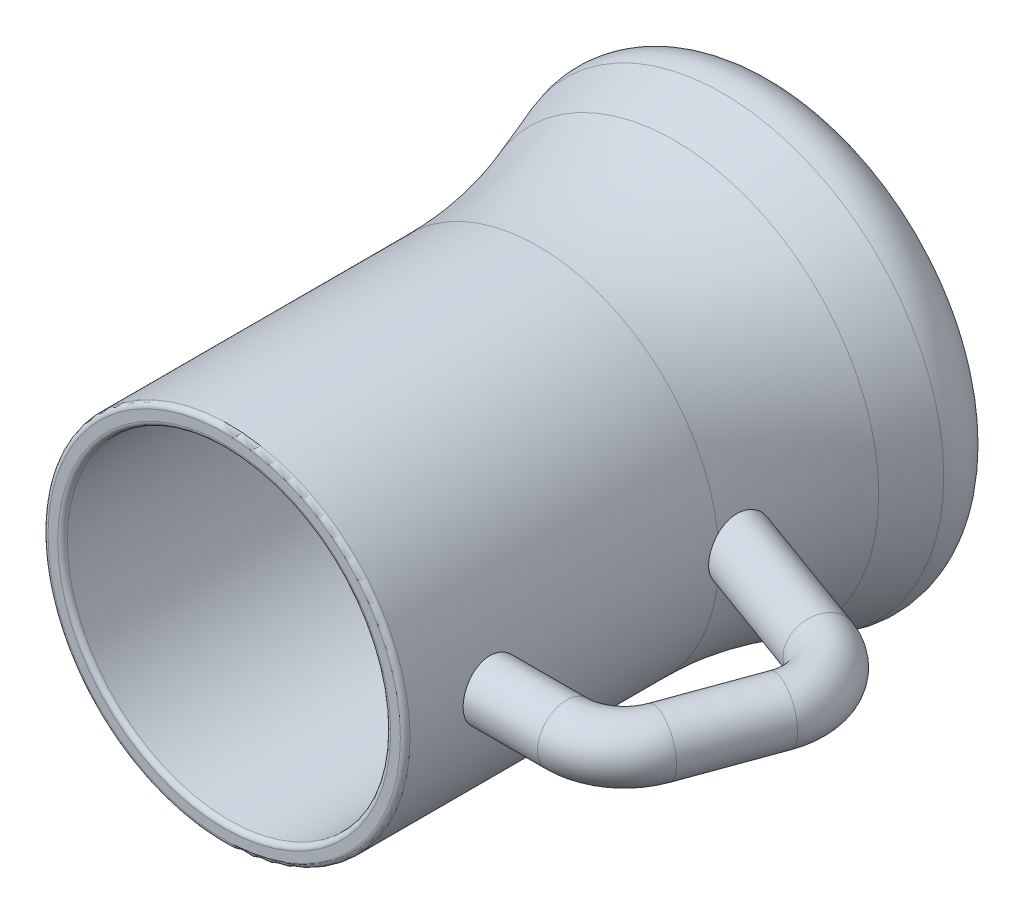
ISO-10303-21;
HEADER;
FILE_DESCRIPTION(('STEP AP214'),'2;1');
FILE_NAME('part.step','',(''),(''),'','','');
FILE_SCHEMA(('AUTOMOTIVE_DESIGN { 1 0 10303 214 1 1 1 1 }'));
ENDSEC;
DATA;
#1=APPLICATION_CONTEXT('core data for automotive mechanical design processes');
#2=APPLICATION_PROTOCOL_DEFINITION('international standard','automotive_design',2000,#1);
#3=PRODUCT_CONTEXT('',#1,'mechanical');
#4=PRODUCT('Part','Part','',(#3));
#5=PRODUCT_RELATED_PRODUCT_CATEGORY('part','',(#4));
#6=PRODUCT_DEFINITION_FORMATION('','',#4);
#7=PRODUCT_DEFINITION_CONTEXT('part definition',#1,'design');
#8=PRODUCT_DEFINITION('design','',#6,#7);
#9=PRODUCT_DEFINITION_SHAPE('','',#8);
#10=(LENGTH_UNIT() NAMED_UNIT(*) SI_UNIT(.MILLI.,.METRE.));
#11=(NAMED_UNIT(*) PLANE_ANGLE_UNIT() SI_UNIT($,.RADIAN.));
#12=(NAMED_UNIT(*) SI_UNIT($,.STERADIAN.) SOLID_ANGLE_UNIT());
#13=UNCERTAINTY_MEASURE_WITH_UNIT(LENGTH_MEASURE(1.E-05),#10,'distance_accuracy_value','');
#14=(GEOMETRIC_REPRESENTATION_CONTEXT(3) GLOBAL_UNCERTAINTY_ASSIGNED_CONTEXT((#13)) GLOBAL_UNIT_ASSIGNED_CONTEXT((#10,
#11,#12)) REPRESENTATION_CONTEXT('',''));
#15=CARTESIAN_POINT('',(0.,0.,0.));
#16=DIRECTION('',(0.,0.,1.));
#17=DIRECTION('',(1.,0.,0.));
#18=AXIS2_PLACEMENT_3D('',#15,#16,#17);
#19=CARTESIAN_POINT('',(0.,0.,130.02398624452));
#20=DIRECTION('',(0.,0.,1.));
#21=DIRECTION('',(1.,0.,0.));
#22=AXIS2_PLACEMENT_3D('',#19,#20,#21);
#23=CYLINDRICAL_SURFACE('',#22,37.5);
#24=CARTESIAN_POINT('',(0.,0.,114.));
#25=DIRECTION('',(0.,0.,1.));
#26=DIRECTION('',(1.,0.,0.));
#27=AXIS2_PLACEMENT_3D('',#24,#25,#26);
#28=CIRCLE('',#27,37.5);
#29=CARTESIAN_POINT('',(37.5,0.,114.));
#30=VERTEX_POINT('',#29);
#31=EDGE_CURVE('E12',#30,#30,#28,.F.);
#32=ORIENTED_EDGE('',*,*,#31,.T.);
#33=EDGE_LOOP('',(#32));
#34=FACE_BOUND('',#33,.T.);
#35=CARTESIAN_POINT('',(37.2399667718745,4.40850029258043,50.));
#36=CARTESIAN_POINT('',(37.2528417213684,4.29973883053072,50.1300651858803));
#37=CARTESIAN_POINT('',(37.2658348105075,4.18590441938662,50.2559125101006));
#38=CARTESIAN_POINT('',(37.2917317094705,3.94854544782049,50.4982373817453));
#39=CARTESIAN_POINT('',(37.3046354718583,3.82501611310328,50.6147102547791));
#40=CARTESIAN_POINT('',(37.3300686730311,3.56828744091065,50.8376941424756));
#41=CARTESIAN_POINT('',(37.3425962877566,3.43504923521504,50.9441607129624));
#42=CARTESIAN_POINT('',(37.3668724624839,3.16004584063132,51.1455168910524));
#43=CARTESIAN_POINT('',(37.3786211383543,3.01828192597008,51.2404082222679));
#44=CARTESIAN_POINT('',(37.4010400076255,2.72647908842261,51.4179112152152));
#45=CARTESIAN_POINT('',(37.4117062539021,2.57641276083976,51.5004784177269));
#46=CARTESIAN_POINT('',(37.4315822409388,2.26942744303802,51.6519149828528));
#47=CARTESIAN_POINT('',(37.4407920855859,2.11250894261324,51.7207853225721));
#48=CARTESIAN_POINT('',(37.4574386130119,1.7932609360937,51.8437786206989));
#49=CARTESIAN_POINT('',(37.4648788675029,1.6309430963465,51.8979313170543));
#50=CARTESIAN_POINT('',(37.4777557109103,1.30189212734659,51.9908753164291));
#51=CARTESIAN_POINT('',(37.4831925010701,1.13515944335913,52.0296681623392));
#52=CARTESIAN_POINT('',(37.4915339935669,0.811775613727049,52.0888999435726));
#53=CARTESIAN_POINT('',(37.4946024225787,0.655345937661658,52.1105293636725));
#54=CARTESIAN_POINT('',(37.4987770444941,0.34116603347988,52.1399088649867));
#55=CARTESIAN_POINT('',(37.4998833646155,0.183415891645174,52.1476598460403));
#56=CARTESIAN_POINT('',(37.500099134858,-0.132180354824011,52.1491734226916));
#57=CARTESIAN_POINT('',(37.4992082188163,-0.290026471750141,52.1429334532613));
#58=CARTESIAN_POINT('',(37.4954567760879,-0.604524981316124,52.1165489187813));
#59=CARTESIAN_POINT('',(37.4925962952565,-0.761177401661687,52.0964046774499));
#60=CARTESIAN_POINT('',(37.4852023409855,-1.06359176095953,52.0439654468914));
#61=CARTESIAN_POINT('',(37.4807685047483,-1.20948205027834,52.0123922376933));
#62=CARTESIAN_POINT('',(37.4703391078392,-1.4981862549288,51.9374391813937));
#63=CARTESIAN_POINT('',(37.464343035285,-1.64099914528317,51.8940554642529));
#64=CARTESIAN_POINT('',(37.4509474773023,-1.92260120012698,51.795980510795));
#65=CARTESIAN_POINT('',(37.4435481600785,-2.06139084458046,51.7412906296601));
#66=CARTESIAN_POINT('',(37.4275332040019,-2.33419505481857,51.6211837467076));
#67=CARTESIAN_POINT('',(37.4189171319166,-2.46820789841771,51.5557629227301));
#68=CARTESIAN_POINT('',(37.3907947124359,-2.87286926826615,51.3384991466776));
#69=CARTESIAN_POINT('',(37.3695903563806,-3.13450062019508,51.1697245712932));
#70=CARTESIAN_POINT('',(37.3248566455903,-3.62860420235922,50.7946961512547));
#71=CARTESIAN_POINT('',(37.3013293206761,-3.8611014938905,50.5884748977329));
#72=CARTESIAN_POINT('',(37.2713894426725,-4.13483814413137,50.3077610844777));
#73=CARTESIAN_POINT('',(37.2650832462096,-4.19126083155353,50.2476149908514));
#74=CARTESIAN_POINT('',(37.2524985855319,-4.30167729253364,50.1253142553859));
#75=CARTESIAN_POINT('',(37.2462200925346,-4.35567498438758,50.0631631546713));
#76=CARTESIAN_POINT('',(37.2399667718745,-4.40850029258047,50.));
#77=B_SPLINE_CURVE_WITH_KNOTS('',3,(#35,#36,#37,#38,#39,#40,#41,#42,#43,#44,#45,#46,#47,#48,#49,
#50,#51,#52,#53,#54,#55,#56,#57,#58,#59,#60,#61,#62,#63,#64,#65,#66,#67,#68,#69,#70,#71,#72,#73,
#74,#75,#76),.UNSPECIFIED.,.F.,.F.,(4,2,2,2,2,2,2,2,2,2,2,2,2,2,2,2,2,2,2,2,4),(0.,
0.510017798316121,1.02028835171471,1.53272767081646,2.04509059169508,2.55925936637044,
3.07339144817252,3.58647683639628,4.09951067231875,4.57274046485726,5.04593957338017,
5.51922544285365,5.99250029369196,6.43999054483434,6.88762760538726,7.33521104223658,
7.78295424743991,8.71505319863551,9.64634476677472,9.89443670666789,10.1421121879903),.UNSPECIFIED.);
#78=CARTESIAN_POINT('',(37.2399667718745,4.40850029258044,50.));
#79=VERTEX_POINT('',#78);
#80=CARTESIAN_POINT('',(37.2399667718745,-4.40850029258043,50.));
#81=VERTEX_POINT('',#80);
#82=EDGE_CURVE('E81',#79,#81,#77,.T.);
#83=ORIENTED_EDGE('',*,*,#82,.F.);
#84=CARTESIAN_POINT('',(0.,0.,50.));
#85=DIRECTION('',(0.,0.,1.));
#86=DIRECTION('',(1.,0.,0.));
#87=AXIS2_PLACEMENT_3D('',#84,#85,#86);
#88=CIRCLE('',#87,37.5);
#89=EDGE_CURVE('E74',#79,#81,#88,.T.);
#90=ORIENTED_EDGE('',*,*,#89,.T.);
#91=EDGE_LOOP('',(#83,#90));
#92=FACE_BOUND('',#91,.T.);
#93=CARTESIAN_POINT('',(37.5,0.,91.));
#94=CARTESIAN_POINT('',(37.5000010297067,0.167423179225958,90.9999975448329));
#95=CARTESIAN_POINT('',(37.4988766771693,0.334812646585461,91.007009863588));
#96=CARTESIAN_POINT('',(37.4944128936514,0.668441726936582,91.0350019838052));
#97=CARTESIAN_POINT('',(37.491073012713,0.834681099420982,91.0559846225426));
#98=CARTESIAN_POINT('',(37.4822675160668,1.16487135268081,91.111780169774));
#99=CARTESIAN_POINT('',(37.4768005161293,1.32882067107968,91.1466020845406));
#100=CARTESIAN_POINT('',(37.4638922302405,1.65322069309242,91.229825774973));
#101=CARTESIAN_POINT('',(37.4564502201466,1.81367009005214,91.2782325319314));
#102=CARTESIAN_POINT('',(37.4398106857423,2.12969171718163,91.3881935527712));
#103=CARTESIAN_POINT('',(37.4306152278353,2.28526943974686,91.4497323508683));
#104=CARTESIAN_POINT('',(37.4107150279844,2.59072128472719,91.5855645314578));
#105=CARTESIAN_POINT('',(37.4000097301527,2.74059328050093,91.6598626138241));
#106=CARTESIAN_POINT('',(37.3773945970652,3.03346959496931,91.8206222872298));
#107=CARTESIAN_POINT('',(37.3654853730654,3.17647734491568,91.9070777143882));
#108=CARTESIAN_POINT('',(37.3407817532782,3.45478588721243,92.0916049748585));
#109=CARTESIAN_POINT('',(37.3279870293669,3.59008378843343,92.1896811239427));
#110=CARTESIAN_POINT('',(37.301770201113,3.85298928374147,92.3975262604128));
#111=CARTESIAN_POINT('',(37.2883440916036,3.98053115354277,92.507377885833));
#112=CARTESIAN_POINT('',(37.2613256645451,4.22597475675382,92.7374373218082));
#113=CARTESIAN_POINT('',(37.2477332873123,4.34387290431423,92.8576489507367));
#114=CARTESIAN_POINT('',(37.2207726911569,4.56912981190639,93.1075279284043));
#115=CARTESIAN_POINT('',(37.2074044048343,4.67649178984925,93.2371923688883));
#116=CARTESIAN_POINT('',(37.1812594611025,4.88000800069889,93.5051694645004));
#117=CARTESIAN_POINT('',(37.1684830237212,4.97615808526981,93.643485291694));
#118=CARTESIAN_POINT('',(37.1438244358879,5.15700333213702,93.9285258735638));
#119=CARTESIAN_POINT('',(37.1319473762706,5.24163517669429,94.0752912578209));
#120=CARTESIAN_POINT('',(37.1095018335648,5.39825294431004,94.3755844166438));
#121=CARTESIAN_POINT('',(37.098933839377,5.47023414687261,94.5291146888653));
#122=CARTESIAN_POINT('',(37.0794246657367,5.60095050678289,94.8417525215417));
#123=CARTESIAN_POINT('',(37.0704828064266,5.65969120221979,95.0008577178847));
#124=CARTESIAN_POINT('',(37.054478291856,5.76353698215718,95.323566424468));
#125=CARTESIAN_POINT('',(37.0474163235514,5.80863708288461,95.4871715550595));
#126=CARTESIAN_POINT('',(37.0294981980135,5.9221980383629,95.98005032948));
#127=CARTESIAN_POINT('',(37.0217144694083,5.97018379729419,96.3144228255584));
#128=CARTESIAN_POINT('',(37.0153633025703,6.00942867521248,96.9863740651942));
#129=CARTESIAN_POINT('',(37.0167952630293,6.00069149527602,97.3239525981279));
#130=CARTESIAN_POINT('',(37.0286324250969,5.92720183110585,97.9895815877446));
#131=CARTESIAN_POINT('',(37.0389524866319,5.86298081421195,98.3176920131676));
#132=CARTESIAN_POINT('',(37.0672741331649,5.68115953303478,98.9584068323246));
#133=CARTESIAN_POINT('',(37.0852759626925,5.56355756949674,99.2710107320939));
#134=CARTESIAN_POINT('',(37.1270245256994,5.27777333132398,99.8734568275056));
#135=CARTESIAN_POINT('',(37.1507964469265,5.10936848577275,100.163191637414));
#136=CARTESIAN_POINT('',(37.2013892244405,4.72691566773003,100.710491076718));
#137=CARTESIAN_POINT('',(37.2282103078337,4.51286429437435,100.968053306849));
#138=CARTESIAN_POINT('',(37.2822543787543,4.04228949845585,101.446776330029));
#139=CARTESIAN_POINT('',(37.3094784614686,3.78530955988793,101.667488502113));
#140=CARTESIAN_POINT('',(37.3609778111527,3.23772113052164,102.062724235623));
#141=CARTESIAN_POINT('',(37.3852530617817,2.94711245338832,102.237247541102));
#142=CARTESIAN_POINT('',(37.4281501713543,2.34010766318689,102.535185029246));
#143=CARTESIAN_POINT('',(37.4467678728077,2.02369280178977,102.658561650538));
#144=CARTESIAN_POINT('',(37.4762182677123,1.37426950229409,102.850298075046));
#145=CARTESIAN_POINT('',(37.4870515607766,1.04126234437104,102.918662115789));
#146=CARTESIAN_POINT('',(37.4996323936636,0.371976166048773,102.997829410061));
#147=CARTESIAN_POINT('',(37.5014771989801,0.035771800820724,103.0092488992));
#148=CARTESIAN_POINT('',(37.4961389253268,-0.633748114372853,102.975842853845));
#149=CARTESIAN_POINT('',(37.4889561656159,-0.96706376607768,102.931019308379));
#150=CARTESIAN_POINT('',(37.4664300043718,-1.61945639518903,102.78691211069));
#151=CARTESIAN_POINT('',(37.4511320333319,-1.9386020249721,102.687931543746));
#152=CARTESIAN_POINT('',(37.4140843851777,-2.55576896999204,102.438641574749));
#153=CARTESIAN_POINT('',(37.392334369717,-2.85378917639216,102.288329480799));
#154=CARTESIAN_POINT('',(37.344555642749,-3.42293596002199,101.939218076078));
#155=CARTESIAN_POINT('',(37.3184933162451,-3.69382203414239,101.740031369112));
#156=CARTESIAN_POINT('',(37.2650878729161,-4.19854244432891,101.299359259713));
#157=CARTESIAN_POINT('',(37.2377446708669,-4.43237431041367,101.057871039778));
#158=CARTESIAN_POINT('',(37.1845470423324,-4.85861608957723,100.536699880366));
#159=CARTESIAN_POINT('',(37.1587092452075,-5.05061097360007,100.256675579723));
#160=CARTESIAN_POINT('',(37.1117524574538,-5.3848343251556,99.6679747406724));
#161=CARTESIAN_POINT('',(37.0906333260134,-5.52706427781566,99.3592990576518));
#162=CARTESIAN_POINT('',(37.0556256843081,-5.75709605637899,98.7233136839854));
#163=CARTESIAN_POINT('',(37.041709120546,-5.84510931144624,98.396081883175));
#164=CARTESIAN_POINT('',(37.0226190222289,-5.96485669264979,97.7310530473684));
#165=CARTESIAN_POINT('',(37.0174447926263,-5.99659529283781,97.3932568544552));
#166=CARTESIAN_POINT('',(37.0166748542779,-6.00130028924052,96.8884487025562));
#167=CARTESIAN_POINT('',(37.0175606744562,-5.99585788857062,96.721371492288));
#168=CARTESIAN_POINT('',(37.0215687929568,-5.97106768469098,96.3882957817168));
#169=CARTESIAN_POINT('',(37.0246902523302,-5.95172509767428,96.222296900331));
#170=CARTESIAN_POINT('',(37.0330845058553,-5.89926634093825,95.8924970267949));
#171=CARTESIAN_POINT('',(37.038358070928,-5.86614523543575,95.7286968439965));
#172=CARTESIAN_POINT('',(37.0509005138249,-5.78639793610083,95.4045562814721));
#173=CARTESIAN_POINT('',(37.0581686720823,-5.73977661225484,95.2442146764916));
#174=CARTESIAN_POINT('',(37.0744876957454,-5.63340499429301,94.9281567948623));
#175=CARTESIAN_POINT('',(37.0835374222532,-5.57366308492977,94.7724376360421));
#176=CARTESIAN_POINT('',(37.1031616451686,-5.44149381296154,94.4666466412756));
#177=CARTESIAN_POINT('',(37.1137355938816,-5.36907100495135,94.3165728011333));
#178=CARTESIAN_POINT('',(37.1361173698711,-5.21201282464205,94.0229797787779));
#179=CARTESIAN_POINT('',(37.1479256749221,-5.1273727186065,93.8794631657477));
#180=CARTESIAN_POINT('',(37.172438533989,-4.94652741293955,93.6000662881418));
#181=CARTESIAN_POINT('',(37.1851427709992,-4.85032629551532,93.4641833528306));
#182=CARTESIAN_POINT('',(37.2112463277708,-4.64584610822241,93.1994201742006));
#183=CARTESIAN_POINT('',(37.2246518854033,-4.53744270444941,93.070636551549));
#184=CARTESIAN_POINT('',(37.2516413357882,-4.31025462520875,92.8226839823523));
#185=CARTESIAN_POINT('',(37.265225162959,-4.1914736812168,92.7035116092689));
#186=CARTESIAN_POINT('',(37.2922035001734,-3.94423963396234,92.4754811430933));
#187=CARTESIAN_POINT('',(37.305597892233,-3.81578079318061,92.3666292562169));
#188=CARTESIAN_POINT('',(37.3318093493354,-3.55018419875224,92.1601157730103));
#189=CARTESIAN_POINT('',(37.3446266257092,-3.41304966699032,92.0624500599102));
#190=CARTESIAN_POINT('',(37.3694136446143,-3.13005260320636,91.8783345661303));
#191=CARTESIAN_POINT('',(37.3813771244772,-2.98413768991785,91.7919644248338));
#192=CARTESIAN_POINT('',(37.4040171674335,-2.68550080015101,91.6318737290757));
#193=CARTESIAN_POINT('',(37.4146942033656,-2.53278135315885,91.5581485226594));
#194=CARTESIAN_POINT('',(37.4344554358417,-2.22166903273263,91.4239024145374));
#195=CARTESIAN_POINT('',(37.4435407619572,-2.06328027949445,91.3633721414123));
#196=CARTESIAN_POINT('',(37.459866954328,-1.7419151793877,91.2559210476895));
#197=CARTESIAN_POINT('',(37.4671082233894,-1.57893984304042,91.208997254653));
#198=CARTESIAN_POINT('',(37.4820441859814,-1.18310727034035,91.1130005828138));
#199=CARTESIAN_POINT('',(37.4887467718645,-0.948542480152331,91.0706744533807));
#200=CARTESIAN_POINT('',(37.4977239136334,-0.475962393586731,91.0141761197434));
#201=CARTESIAN_POINT('',(37.499998536548,-0.237947149495822,91.0000034893616));
#202=CARTESIAN_POINT('',(37.5,0.,91.));
#203=B_SPLINE_CURVE_WITH_KNOTS('',3,(#93,#94,#95,#96,#97,#98,#99,#100,#101,#102,#103,#104,#105,
#106,#107,#108,#109,#110,#111,#112,#113,#114,#115,#116,#117,#118,#119,#120,#121,#122,#123,#124,
#125,#126,#127,#128,#129,#130,#131,#132,#133,#134,#135,#136,#137,#138,#139,#140,#141,#142,#143,
#144,#145,#146,#147,#148,#149,#150,#151,#152,#153,#154,#155,#156,#157,#158,#159,#160,#161,#162,
#163,#164,#165,#166,#167,#168,#169,#170,#171,#172,#173,#174,#175,#176,#177,#178,#179,#180,#181,
#182,#183,#184,#185,#186,#187,#188,#189,#190,#191,#192,#193,#194,#195,#196,#197,#198,#199,#200,
#201,#202),.UNSPECIFIED.,.T.,.F.,(4,2,2,2,2,2,2,2,2,2,2,2,2,2,2,2,2,2,2,2,2,2,2,2,2,2,2,2,2,2,2,
2,2,2,2,2,2,2,2,2,2,2,2,2,2,2,2,2,2,2,2,2,2,2,4),(0.,0.502061033952685,1.00422406414131,
1.50671442664131,2.00938928368627,2.51147536911428,3.01374679586893,3.51576447863905,
4.0179691915526,4.52396297768836,5.03014406148881,5.53617006537241,6.04238270584965,
6.55127445016459,7.06035568245511,7.56922358525778,8.07827718575869,9.08662964093766,
10.0949163034728,11.093650563577,12.0924166182278,13.0956234989116,14.0989051489866,
15.1136282869837,16.1283570477737,17.1438296959426,18.1592241164679,19.1636060513655,
20.1679524674061,21.1667347936735,22.1655695055297,23.1725926653774,24.1796829237601,
25.1963496994602,26.2129861323377,27.2256324596715,28.2381982741128,28.7392145252925,
29.2400428628973,29.741050763466,30.2418781581664,30.7423864240038,31.2427152898078,
31.7432385369225,32.2435855651089,32.7495934350752,33.2554201016331,33.7615490425953,
34.267491113829,34.7768273764383,35.2859758551406,35.7947615352543,36.3034359833941,
37.0169919013882,37.7305370177471),.UNSPECIFIED.);
#204=CARTESIAN_POINT('',(37.5,0.,91.));
#205=VERTEX_POINT('',#204);
#206=EDGE_CURVE('E89',#205,#205,#203,.T.);
#207=ORIENTED_EDGE('',*,*,#206,.F.);
#208=EDGE_LOOP('',(#207));
#209=FACE_BOUND('',#208,.T.);
#210=ADVANCED_FACE('F60',(#34,#92,#209),#23,.T.);
#211=CARTESIAN_POINT('',(0.,0.,130.02398624452));
#212=DIRECTION('',(0.,0.,1.));
#213=DIRECTION('',(1.,0.,0.));
#214=AXIS2_PLACEMENT_3D('',#211,#212,#213);
#215=CYLINDRICAL_SURFACE('',#214,33.5);
#216=CARTESIAN_POINT('',(0.,0.,114.));
#217=DIRECTION('',(0.,0.,1.));
#218=DIRECTION('',(1.,0.,0.));
#219=AXIS2_PLACEMENT_3D('',#216,#217,#218);
#220=CIRCLE('',#219,33.5);
#221=CARTESIAN_POINT('',(33.5,0.,114.));
#222=VERTEX_POINT('',#221);
#223=EDGE_CURVE('E96',#222,#222,#220,.T.);
#224=ORIENTED_EDGE('',*,*,#223,.T.);
#225=EDGE_LOOP('',(#224));
#226=FACE_BOUND('',#225,.T.);
#227=CARTESIAN_POINT('',(0.,0.,50.));
#228=DIRECTION('',(0.,0.,1.));
#229=DIRECTION('',(1.,0.,0.));
#230=AXIS2_PLACEMENT_3D('',#227,#228,#229);
#231=CIRCLE('',#230,33.5);
#232=CARTESIAN_POINT('',(33.5,0.,50.));
#233=VERTEX_POINT('',#232);
#234=EDGE_CURVE('E93',#233,#233,#231,.T.);
#235=ORIENTED_EDGE('',*,*,#234,.F.);
#236=EDGE_LOOP('',(#235));
#237=FACE_BOUND('',#236,.T.);
#238=ADVANCED_FACE('F134',(#226,#237),#215,.F.);
#239=CARTESIAN_POINT('',(0.,0.,50.));
#240=DIRECTION('',(0.,0.,1.));
#241=DIRECTION('',(1.,0.,0.));
#242=AXIS2_PLACEMENT_3D('',#239,#240,#241);
#243=TOROIDAL_SURFACE('',#242,122.5,89.);
#244=CARTESIAN_POINT('',(0.,0.,20.4074490284231));
#245=DIRECTION('',(0.,0.,1.));
#246=DIRECTION('',(1.,0.,0.));
#247=AXIS2_PLACEMENT_3D('',#244,#245,#246);
#248=CIRCLE('',#247,38.56382825626);
#249=CARTESIAN_POINT('',(38.56382825626,0.,20.4074490284231));
#250=VERTEX_POINT('',#249);
#251=EDGE_CURVE('E97',#250,#250,#248,.T.);
#252=ORIENTED_EDGE('',*,*,#251,.F.);
#253=EDGE_LOOP('',(#252));
#254=FACE_BOUND('',#253,.T.);
#255=ORIENTED_EDGE('',*,*,#234,.T.);
#256=EDGE_LOOP('',(#255));
#257=FACE_BOUND('',#256,.T.);
#258=ADVANCED_FACE('F172',(#254,#257),#243,.T.);
#259=CARTESIAN_POINT('',(0.,0.,50.));
#260=DIRECTION('',(0.,0.,1.));
#261=DIRECTION('',(1.,0.,0.));
#262=AXIS2_PLACEMENT_3D('',#259,#260,#261);
#263=TOROIDAL_SURFACE('',#262,122.5,85.);
#264=CARTESIAN_POINT('',(0.,0.,21.7374513192804));
#265=DIRECTION('',(0.,0.,1.));
#266=DIRECTION('',(1.,0.,0.));
#267=AXIS2_PLACEMENT_3D('',#264,#265,#266);
#268=CIRCLE('',#267,42.3362404694618);
#269=CARTESIAN_POINT('',(42.3362404694618,0.,21.7374513192804));
#270=VERTEX_POINT('',#269);
#271=EDGE_CURVE('E79',#270,#270,#268,.T.);
#272=ORIENTED_EDGE('',*,*,#271,.T.);
#273=EDGE_LOOP('',(#272));
#274=FACE_BOUND('',#273,.T.);
#275=CARTESIAN_POINT('',(37.2399865725596,-4.40833302884763,50.0002));
#276=CARTESIAN_POINT('',(37.2255205776317,-4.53047535117579,49.8541571706795));
#277=CARTESIAN_POINT('',(37.2115815309379,-4.64633195415578,49.7028346884811));
#278=CARTESIAN_POINT('',(37.185315925127,-4.86492539252801,49.390883278433));
#279=CARTESIAN_POINT('',(37.1729891829799,-4.96766371708601,49.2302554099305));
#280=CARTESIAN_POINT('',(37.1504906068594,-5.15960802122379,48.9007273506968));
#281=CARTESIAN_POINT('',(37.1403212092221,-5.24879866918957,48.7318180697171));
#282=CARTESIAN_POINT('',(37.1226517172428,-5.41299113129567,48.3870974383431));
#283=CARTESIAN_POINT('',(37.1151516950426,-5.48799256193743,48.2112859015535));
#284=CARTESIAN_POINT('',(37.1032615216721,-5.623286153139,47.8539703673108));
#285=CARTESIAN_POINT('',(37.0988716142528,-5.68357716054672,47.6724659248479));
#286=CARTESIAN_POINT('',(37.0935706264917,-5.78893957358151,47.3049688321736));
#287=CARTESIAN_POINT('',(37.09266073997,-5.83400575150302,47.1189746637782));
#288=CARTESIAN_POINT('',(37.0946067114892,-5.90835719090076,46.7440039173566));
#289=CARTESIAN_POINT('',(37.0974599701553,-5.93765332578357,46.5550294869877));
#290=CARTESIAN_POINT('',(37.107110387718,-5.98004161935794,46.175374391595));
#291=CARTESIAN_POINT('',(37.1139072791413,-5.99313487680596,45.9846938431506));
#292=CARTESIAN_POINT('',(37.1313328464027,-6.00262392726032,45.6069301735269));
#293=CARTESIAN_POINT('',(37.1418817693451,-5.99935000228885,45.4198517690345));
#294=CARTESIAN_POINT('',(37.1667622754815,-5.97658549909776,45.0470048841206));
#295=CARTESIAN_POINT('',(37.1810922964514,-5.95710161115442,44.8612358951631));
#296=CARTESIAN_POINT('',(37.2133439259513,-5.9017743394306,44.4924609699245));
#297=CARTESIAN_POINT('',(37.2312655065115,-5.86593108304768,44.309455012138));
#298=CARTESIAN_POINT('',(37.2703718322564,-5.77789239850451,43.9477767220138));
#299=CARTESIAN_POINT('',(37.2915563735637,-5.72569799179141,43.7691041197249));
#300=CARTESIAN_POINT('',(37.3352335285582,-5.60913796598685,43.4292856158329));
#301=CARTESIAN_POINT('',(37.3575471278866,-5.54580487088289,43.2677618441836));
#302=CARTESIAN_POINT('',(37.4041482573866,-5.40535707257945,42.9511201898542));
#303=CARTESIAN_POINT('',(37.4284356862341,-5.32824307656357,42.7960019789676));
#304=CARTESIAN_POINT('',(37.4784340376955,-5.16070901265797,42.4934080848605));
#305=CARTESIAN_POINT('',(37.5041446715251,-5.07029163804435,42.34593086287));
#306=CARTESIAN_POINT('',(37.5563893148497,-4.87674374252829,42.0597238499672));
#307=CARTESIAN_POINT('',(37.5829233091937,-4.77361345545657,41.9209938982358));
#308=CARTESIAN_POINT('',(37.6350909551794,-4.55981098276041,41.658764665849));
#309=CARTESIAN_POINT('',(37.6607174784178,-4.44961429237834,41.5348758720079));
#310=CARTESIAN_POINT('',(37.7115635875427,-4.21891927729732,41.2969168078168));
#311=CARTESIAN_POINT('',(37.7367830340914,-4.09841751059231,41.1828498437949));
#312=CARTESIAN_POINT('',(37.7862173123466,-3.84804330410756,40.965379257784));
#313=CARTESIAN_POINT('',(37.8104325338194,-3.71817455453834,40.8619714750914));
#314=CARTESIAN_POINT('',(37.8573198001075,-3.4498982582813,40.6663925564036));
#315=CARTESIAN_POINT('',(37.879991269738,-3.31148756518121,40.5742255986048));
#316=CARTESIAN_POINT('',(37.9231449513392,-3.02790313128413,40.402195244215));
#317=CARTESIAN_POINT('',(37.9436379680898,-2.88276844243592,40.3222701657075));
#318=CARTESIAN_POINT('',(37.9821089361329,-2.58604352188367,40.1745989340057));
#319=CARTESIAN_POINT('',(38.0000859636136,-2.43445094550576,40.1068572516775));
#320=CARTESIAN_POINT('',(38.033100697945,-2.12598442124462,39.9840043479027));
#321=CARTESIAN_POINT('',(38.0481394271772,-1.96911233271996,39.9288887320584));
#322=CARTESIAN_POINT('',(38.0749488378248,-1.65108158875417,39.8315531097048));
#323=CARTESIAN_POINT('',(38.0867183067143,-1.48992136711922,39.7893378872031));
#324=CARTESIAN_POINT('',(38.1067682713939,-1.16363229919405,39.717876710281));
#325=CARTESIAN_POINT('',(38.1150298150537,-0.998486865108712,39.6887011613406));
#326=CARTESIAN_POINT('',(38.1277859825544,-0.666171401991861,39.6438052331373));
#327=CARTESIAN_POINT('',(38.1322792106595,-0.499000646042886,39.6280898392972));
#328=CARTESIAN_POINT('',(38.1373898057384,-0.163934564454042,39.6102232842466));
#329=CARTESIAN_POINT('',(38.1380085225223,0.00396048845294461,39.6080673991458));
#330=CARTESIAN_POINT('',(38.1353597888,0.339404741841905,39.6173190902176));
#331=CARTESIAN_POINT('',(38.132090902225,0.506953791603155,39.6287316785423));
#332=CARTESIAN_POINT('',(38.1217246208453,0.840858328966124,39.6651142767054));
#333=CARTESIAN_POINT('',(38.1146184025448,1.00721016688482,39.6901155329652));
#334=CARTESIAN_POINT('',(38.0967418457803,1.33715172511205,39.7535419579503));
#335=CARTESIAN_POINT('',(38.085970150892,1.50074039934455,39.7919720962286));
#336=CARTESIAN_POINT('',(38.0485025949965,1.98547000945442,39.9271162869293));
#337=CARTESIAN_POINT('',(38.0166422633818,2.30093749561842,40.0437237704992));
#338=CARTESIAN_POINT('',(37.9421257195415,2.90652971276292,40.3270114772279));
#339=CARTESIAN_POINT('',(37.8994810488073,3.19668109354748,40.4936382047997));
#340=CARTESIAN_POINT('',(37.8073059738672,3.74391116053909,40.8729989448296));
#341=CARTESIAN_POINT('',(37.757775959844,4.00099171923478,41.0857303449824));
#342=CARTESIAN_POINT('',(37.6566525666098,4.47347888691109,41.5505941274554));
#343=CARTESIAN_POINT('',(37.6050710956906,4.68909281746759,41.8025184649383));
#344=CARTESIAN_POINT('',(37.5042355694213,5.07442700242146,42.3396901103417));
#345=CARTESIAN_POINT('',(37.4549813454913,5.24415058522013,42.6249349993911));
#346=CARTESIAN_POINT('',(37.363108270606,5.53327166517404,43.2199672135457));
#347=CARTESIAN_POINT('',(37.3204739155694,5.65278790654962,43.529694548776));
#348=CARTESIAN_POINT('',(37.2449331775864,5.84000640853943,44.1655040295091));
#349=CARTESIAN_POINT('',(37.2120272430804,5.90770628085875,44.4915869281266));
#350=CARTESIAN_POINT('',(37.1573143603375,5.9920422488456,45.1584400360841));
#351=CARTESIAN_POINT('',(37.1357659435525,6.00752894996423,45.4993754944201));
#352=CARTESIAN_POINT('',(37.105495593475,5.98570174182934,46.1801641248006));
#353=CARTESIAN_POINT('',(37.0967795389277,5.94836364789889,46.520016729675));
#354=CARTESIAN_POINT('',(37.0913341379562,5.81977117260666,47.2095951994641));
#355=CARTESIAN_POINT('',(37.095320419853,5.7255493199728,47.5587705809989));
#356=CARTESIAN_POINT('',(37.1147763683563,5.4842730521673,48.2379017103886));
#357=CARTESIAN_POINT('',(37.1302409355528,5.33724211323357,48.5678659229279));
#358=CARTESIAN_POINT('',(37.1622322197413,5.05809360981486,49.0823111575563));
#359=CARTESIAN_POINT('',(37.1762139092362,4.94084913367355,49.2751715764058));
#360=CARTESIAN_POINT('',(37.2065473530241,4.68809548003871,49.647832121582));
#361=CARTESIAN_POINT('',(37.2228949644558,4.55261825758237,49.8276542691201));
#362=CARTESIAN_POINT('',(37.2399865725596,4.40833302884762,50.0002));
#363=B_SPLINE_CURVE_WITH_KNOTS('',3,(#275,#276,#277,#278,#279,#280,#281,#282,#283,#284,#285,
#286,#287,#288,#289,#290,#291,#292,#293,#294,#295,#296,#297,#298,#299,#300,#301,#302,#303,#304,
#305,#306,#307,#308,#309,#310,#311,#312,#313,#314,#315,#316,#317,#318,#319,#320,#321,#322,#323,
#324,#325,#326,#327,#328,#329,#330,#331,#332,#333,#334,#335,#336,#337,#338,#339,#340,#341,#342,
#343,#344,#345,#346,#347,#348,#349,#350,#351,#352,#353,#354,#355,#356,#357,#358,#359,#360,#361,
#362),.UNSPECIFIED.,.F.,.F.,(4,2,2,2,2,2,2,2,2,2,2,2,2,2,2,2,2,2,2,2,2,2,2,2,2,2,2,2,2,2,2,2,2,
2,2,2,2,2,2,2,2,2,2,4),(0.,0.572599462234861,1.14513386600619,1.71831144323894,2.29150450979463,
2.86474249460701,3.43817711090275,4.01121583732383,4.58421570246728,5.14569994299819,
5.7069525591721,6.26820080470064,6.82941399635687,7.35353221652484,7.87762354865107,
8.40160892383037,8.92558466269666,9.42831009324907,9.93120410027282,10.4339010583927,
10.9367843023578,11.4370438823349,11.9374866665882,12.4377550103631,12.9382086501366,
13.441332690989,13.944643000335,14.4477779556578,14.9510988252353,15.4555819812623,
15.9602520266735,16.9685099894134,17.9756934389126,18.9828198359918,19.9847719400898,
20.9866513536555,21.9861477202247,22.9856901523209,24.0070971863693,25.0289720006421,
26.1094138249387,27.1893759329505,27.8667457505088,28.5429434932403),.UNSPECIFIED.);
#364=EDGE_CURVE('E75',#81,#79,#363,.T.);
#365=ORIENTED_EDGE('',*,*,#364,.F.);
#366=ORIENTED_EDGE('',*,*,#89,.F.);
#367=EDGE_LOOP('',(#365,#366));
#368=FACE_BOUND('',#367,.T.);
#369=ADVANCED_FACE('F76',(#274,#368),#263,.F.);
#370=CARTESIAN_POINT('',(-33.5,0.,115.));
#371=DIRECTION('',(0.,0.,1.));
#372=DIRECTION('',(1.,0.,0.));
#373=AXIS2_PLACEMENT_3D('',#370,#371,#372);
#374=PLANE('',#373);
#375=CARTESIAN_POINT('',(0.,0.,115.));
#376=DIRECTION('',(0.,0.,1.));
#377=DIRECTION('',(1.,0.,0.));
#378=AXIS2_PLACEMENT_3D('',#375,#376,#377);
#379=CIRCLE('',#378,34.5);
#380=CARTESIAN_POINT('',(34.5,0.,115.));
#381=VERTEX_POINT('',#380);
#382=EDGE_CURVE('E66',#381,#381,#379,.F.);
#383=ORIENTED_EDGE('',*,*,#382,.T.);
#384=EDGE_LOOP('',(#383));
#385=FACE_BOUND('',#384,.T.);
#386=CARTESIAN_POINT('',(0.,0.,115.));
#387=DIRECTION('',(0.,0.,1.));
#388=DIRECTION('',(1.,0.,0.));
#389=AXIS2_PLACEMENT_3D('',#386,#387,#388);
#390=CIRCLE('',#389,36.5);
#391=CARTESIAN_POINT('',(36.5,0.,115.));
#392=VERTEX_POINT('',#391);
#393=EDGE_CURVE('E160',#392,#392,#390,.T.);
#394=ORIENTED_EDGE('',*,*,#393,.T.);
#395=EDGE_LOOP('',(#394));
#396=FACE_BOUND('',#395,.T.);
#397=ADVANCED_FACE('F140',(#385,#396),#374,.T.);
#398=CARTESIAN_POINT('',(0.,0.,10.4587858753982));
#399=DIRECTION('',(0.,0.,-1.));
#400=DIRECTION('',(-1.,0.,0.));
#401=AXIS2_PLACEMENT_3D('',#398,#399,#400);
#402=CONICAL_SURFACE('',#401,42.0713306278689,0.338953771192143);
#403=ORIENTED_EDGE('',*,*,#251,.T.);
#404=EDGE_LOOP('',(#403));
#405=FACE_BOUND('',#404,.T.);
#406=CARTESIAN_POINT('',(0.,0.,10.4587858753982));
#407=DIRECTION('',(0.,0.,1.));
#408=DIRECTION('',(1.,0.,0.));
#409=AXIS2_PLACEMENT_3D('',#406,#407,#408);
#410=CIRCLE('',#409,42.0713306278689);
#411=CARTESIAN_POINT('',(42.0713306278689,0.,10.4587858753982));
#412=VERTEX_POINT('',#411);
#413=EDGE_CURVE('E199',#412,#412,#410,.T.);
#414=ORIENTED_EDGE('',*,*,#413,.F.);
#415=EDGE_LOOP('',(#414));
#416=FACE_BOUND('',#415,.T.);
#417=ADVANCED_FACE('F163',(#405,#416),#402,.F.);
#418=CARTESIAN_POINT('',(0.,0.,8.84711677252152));
#419=DIRECTION('',(0.,0.,1.));
#420=DIRECTION('',(1.,0.,0.));
#421=AXIS2_PLACEMENT_3D('',#418,#419,#420);
#422=TOROIDAL_SURFACE('',#421,37.5,4.84711677252152);
#423=ORIENTED_EDGE('',*,*,#413,.T.);
#424=EDGE_LOOP('',(#423));
#425=FACE_BOUND('',#424,.T.);
#426=CARTESIAN_POINT('',(0.,0.,4.));
#427=DIRECTION('',(0.,0.,1.));
#428=DIRECTION('',(1.,0.,0.));
#429=AXIS2_PLACEMENT_3D('',#426,#427,#428);
#430=CIRCLE('',#429,37.5);
#431=CARTESIAN_POINT('',(37.5,0.,4.));
#432=VERTEX_POINT('',#431);
#433=EDGE_CURVE('E198',#432,#432,#430,.T.);
#434=ORIENTED_EDGE('',*,*,#433,.F.);
#435=EDGE_LOOP('',(#434));
#436=FACE_BOUND('',#435,.T.);
#437=ADVANCED_FACE('F166',(#425,#436),#422,.F.);
#438=CARTESIAN_POINT('',(0.,0.,4.));
#439=DIRECTION('',(0.,0.,1.));
#440=DIRECTION('',(1.,0.,0.));
#441=AXIS2_PLACEMENT_3D('',#438,#439,#440);
#442=PLANE('',#441);
#443=ORIENTED_EDGE('',*,*,#433,.T.);
#444=EDGE_LOOP('',(#443));
#445=FACE_BOUND('',#444,.T.);
#446=ADVANCED_FACE('F214',(#445),#442,.T.);
#447=CARTESIAN_POINT('',(0.,0.,0.));
#448=DIRECTION('',(0.,0.,1.));
#449=DIRECTION('',(1.,0.,0.));
#450=AXIS2_PLACEMENT_3D('',#447,#448,#449);
#451=PLANE('',#450);
#452=CARTESIAN_POINT('',(0.,0.,0.));
#453=DIRECTION('',(0.,0.,1.));
#454=DIRECTION('',(1.,0.,0.));
#455=AXIS2_PLACEMENT_3D('',#452,#453,#454);
#456=CIRCLE('',#455,37.5);
#457=CARTESIAN_POINT('',(37.5,0.,0.));
#458=VERTEX_POINT('',#457);
#459=EDGE_CURVE('E189',#458,#458,#456,.T.);
#460=ORIENTED_EDGE('',*,*,#459,.F.);
#461=EDGE_LOOP('',(#460));
#462=FACE_BOUND('',#461,.T.);
#463=ADVANCED_FACE('F218',(#462),#451,.F.);
#464=CARTESIAN_POINT('',(0.,0.,8.84711677252152));
#465=DIRECTION('',(0.,0.,1.));
#466=DIRECTION('',(1.,0.,0.));
#467=AXIS2_PLACEMENT_3D('',#464,#465,#466);
#468=TOROIDAL_SURFACE('',#467,37.5,8.84711677252152);
#469=CARTESIAN_POINT('',(0.,0.,11.7887881662556));
#470=DIRECTION('',(0.,0.,1.));
#471=DIRECTION('',(1.,0.,0.));
#472=AXIS2_PLACEMENT_3D('',#469,#470,#471);
#473=CIRCLE('',#472,45.8437428410707);
#474=CARTESIAN_POINT('',(45.8437428410707,0.,11.7887881662556));
#475=VERTEX_POINT('',#474);
#476=EDGE_CURVE('E186',#475,#475,#473,.T.);
#477=ORIENTED_EDGE('',*,*,#476,.F.);
#478=EDGE_LOOP('',(#477));
#479=FACE_BOUND('',#478,.T.);
#480=ORIENTED_EDGE('',*,*,#459,.T.);
#481=EDGE_LOOP('',(#480));
#482=FACE_BOUND('',#481,.T.);
#483=ADVANCED_FACE('F224',(#479,#482),#468,.T.);
#484=CARTESIAN_POINT('',(0.,0.,11.7887881662556));
#485=DIRECTION('',(0.,0.,-1.));
#486=DIRECTION('',(-1.,0.,0.));
#487=AXIS2_PLACEMENT_3D('',#484,#485,#486);
#488=CONICAL_SURFACE('',#487,45.8437428410707,0.338953771192145);
#489=ORIENTED_EDGE('',*,*,#271,.F.);
#490=EDGE_LOOP('',(#489));
#491=FACE_BOUND('',#490,.T.);
#492=ORIENTED_EDGE('',*,*,#476,.T.);
#493=EDGE_LOOP('',(#492));
#494=FACE_BOUND('',#493,.T.);
#495=ADVANCED_FACE('F226',(#491,#494),#488,.T.);
#496=CARTESIAN_POINT('',(59.6194468306611,0.,66.5843648980865));
#497=DIRECTION('',(0.,1.,0.));
#498=DIRECTION('',(0.,0.,1.));
#499=AXIS2_PLACEMENT_3D('',#496,#497,#498);
#500=TOROIDAL_SURFACE('',#499,12.,6.);
#501=CARTESIAN_POINT('',(70.895758280092,0.,70.6886066179946));
#502=DIRECTION('',(-0.342020143325666,0.,0.939692620785909));
#503=DIRECTION('',(0.939692620785909,0.,0.342020143325666));
#504=AXIS2_PLACEMENT_3D('',#501,#502,#503);
#505=CIRCLE('',#504,6.);
#506=CARTESIAN_POINT('',(76.5339140048074,0.,72.7407274779487));
#507=VERTEX_POINT('',#506);
#508=EDGE_CURVE('E244',#507,#507,#505,.T.);
#509=CARTESIAN_POINT('',(63.7236885505688,0.,55.3080534486556));
#510=DIRECTION('',(0.93969262078591,0.,0.342020143325666));
#511=DIRECTION('',(0.342020143325666,0.,-0.93969262078591));
#512=AXIS2_PLACEMENT_3D('',#509,#510,#511);
#513=CIRCLE('',#512,6.);
#514=CARTESIAN_POINT('',(65.7758094105227,0.,49.66989772394));
#515=VERTEX_POINT('',#514);
#516=EDGE_CURVE('E88',#515,#515,#513,.T.);
#517=CARTESIAN_POINT('',(59.6194468306611,0.,66.5843648980865));
#518=DIRECTION('',(0.,1.,0.));
#519=DIRECTION('',(0.,0.,1.));
#520=AXIS2_PLACEMENT_3D('',#517,#518,#519);
#521=CIRCLE('',#520,18.);
#522=EDGE_CURVE('',#507,#515,#521,.T.);
#523=ORIENTED_EDGE('',*,*,#508,.F.);
#524=ORIENTED_EDGE('',*,*,#516,.T.);
#525=ORIENTED_EDGE('',*,*,#522,.T.);
#526=ORIENTED_EDGE('',*,*,#522,.F.);
#527=EDGE_LOOP('',(#523,#525,#524,#526));
#528=FACE_BOUND('',#527,.T.);
#529=ADVANCED_FACE('F117',(#528),#500,.T.);
#530=CARTESIAN_POINT('',(64.1930152578877,0.,89.1042417199079));
#531=DIRECTION('',(0.342020143325666,0.,-0.939692620785909));
#532=DIRECTION('',(-0.939692620785909,0.,-0.342020143325666));
#533=AXIS2_PLACEMENT_3D('',#530,#531,#532);
#534=CYLINDRICAL_SURFACE('',#533,6.);
#535=ORIENTED_EDGE('',*,*,#508,.T.);
#536=EDGE_LOOP('',(#535));
#537=FACE_BOUND('',#536,.T.);
#538=CARTESIAN_POINT('',(64.1930152578877,0.,89.1042417199079));
#539=DIRECTION('',(-0.342020143325661,0.,0.939692620785911));
#540=DIRECTION('',(0.939692620785911,0.,0.342020143325661));
#541=AXIS2_PLACEMENT_3D('',#538,#539,#540);
#542=CIRCLE('',#541,6.);
#543=CARTESIAN_POINT('',(69.8311709826032,0.,91.1563625798619));
#544=VERTEX_POINT('',#543);
#545=EDGE_CURVE('E250',#544,#544,#542,.T.);
#546=ORIENTED_EDGE('',*,*,#545,.F.);
#547=EDGE_LOOP('',(#546));
#548=FACE_BOUND('',#547,.T.);
#549=ADVANCED_FACE('F229',(#537,#548),#534,.T.);
#550=CARTESIAN_POINT('',(52.9167038084568,0.,85.));
#551=DIRECTION('',(0.,1.,0.));
#552=DIRECTION('',(0.,0.,1.));
#553=AXIS2_PLACEMENT_3D('',#550,#551,#552);
#554=TOROIDAL_SURFACE('',#553,12.,6.);
#555=CARTESIAN_POINT('',(52.9167038084567,0.,97.));
#556=DIRECTION('',(-1.,0.,0.));
#557=DIRECTION('',(0.,0.,1.));
#558=AXIS2_PLACEMENT_3D('',#555,#556,#557);
#559=CIRCLE('',#558,6.);
#560=CARTESIAN_POINT('',(52.9167038084567,0.,103.));
#561=VERTEX_POINT('',#560);
#562=EDGE_CURVE('E253',#561,#561,#559,.T.);
#563=CARTESIAN_POINT('',(52.9167038084568,0.,85.));
#564=DIRECTION('',(0.,1.,0.));
#565=DIRECTION('',(0.,0.,1.));
#566=AXIS2_PLACEMENT_3D('',#563,#564,#565);
#567=CIRCLE('',#566,18.);
#568=EDGE_CURVE('',#561,#544,#567,.T.);
#569=ORIENTED_EDGE('',*,*,#562,.F.);
#570=ORIENTED_EDGE('',*,*,#545,.T.);
#571=ORIENTED_EDGE('',*,*,#568,.T.);
#572=ORIENTED_EDGE('',*,*,#568,.F.);
#573=EDGE_LOOP('',(#569,#571,#570,#572));
#574=FACE_BOUND('',#573,.T.);
#575=ADVANCED_FACE('F116',(#574),#554,.T.);
#576=CARTESIAN_POINT('',(63.723688550569,0.,55.3080534486556));
#577=DIRECTION('',(-0.939692620785909,0.,-0.342020143325666));
#578=DIRECTION('',(-0.342020143325666,0.,0.93969262078591));
#579=AXIS2_PLACEMENT_3D('',#576,#577,#578);
#580=CYLINDRICAL_SURFACE('',#579,6.);
#581=ORIENTED_EDGE('',*,*,#516,.F.);
#582=EDGE_LOOP('',(#581));
#583=FACE_BOUND('',#582,.T.);
#584=ORIENTED_EDGE('',*,*,#364,.T.);
#585=ORIENTED_EDGE('',*,*,#82,.T.);
#586=EDGE_LOOP('',(#584,#585));
#587=FACE_BOUND('',#586,.T.);
#588=ADVANCED_FACE('F86',(#583,#587),#580,.T.);
#589=CARTESIAN_POINT('',(0.,0.,97.));
#590=DIRECTION('',(1.,0.,0.));
#591=DIRECTION('',(0.,0.,-1.));
#592=AXIS2_PLACEMENT_3D('',#589,#590,#591);
#593=CYLINDRICAL_SURFACE('',#592,6.);
#594=ORIENTED_EDGE('',*,*,#562,.T.);
#595=EDGE_LOOP('',(#594));
#596=FACE_BOUND('',#595,.T.);
#597=ORIENTED_EDGE('',*,*,#206,.T.);
#598=EDGE_LOOP('',(#597));
#599=FACE_BOUND('',#598,.T.);
#600=ADVANCED_FACE('F113',(#596,#599),#593,.T.);
#601=CARTESIAN_POINT('',(0.,0.,114.));
#602=DIRECTION('',(0.,0.,1.));
#603=DIRECTION('',(1.,0.,0.));
#604=AXIS2_PLACEMENT_3D('',#601,#602,#603);
#605=TOROIDAL_SURFACE('',#604,34.5,1.);
#606=ORIENTED_EDGE('',*,*,#382,.F.);
#607=EDGE_LOOP('',(#606));
#608=FACE_BOUND('',#607,.T.);
#609=ORIENTED_EDGE('',*,*,#223,.F.);
#610=EDGE_LOOP('',(#609));
#611=FACE_BOUND('',#610,.T.);
#612=ADVANCED_FACE('F137',(#608,#611),#605,.T.);
#613=CARTESIAN_POINT('',(0.,0.,114.));
#614=DIRECTION('',(0.,0.,1.));
#615=DIRECTION('',(1.,0.,0.));
#616=AXIS2_PLACEMENT_3D('',#613,#614,#615);
#617=TOROIDAL_SURFACE('',#616,36.5,1.);
#618=ORIENTED_EDGE('',*,*,#31,.F.);
#619=EDGE_LOOP('',(#618));
#620=FACE_BOUND('',#619,.T.);
#621=ORIENTED_EDGE('',*,*,#393,.F.);
#622=EDGE_LOOP('',(#621));
#623=FACE_BOUND('',#622,.T.);
#624=ADVANCED_FACE('F56',(#620,#623),#617,.T.);
#625=CLOSED_SHELL('',(#210,#238,#258,#369,#397,#417,#437,#446,#463,#483,#495,#529,#549,#575,
#588,#600,#612,#624));
#626=MANIFOLD_SOLID_BREP('B2',#625);
#627=ADVANCED_BREP_SHAPE_REPRESENTATION('',(#18,#626),#14);
#628=SHAPE_DEFINITION_REPRESENTATION(#9,#627);
ENDSEC;
END-ISO-10303-21;
